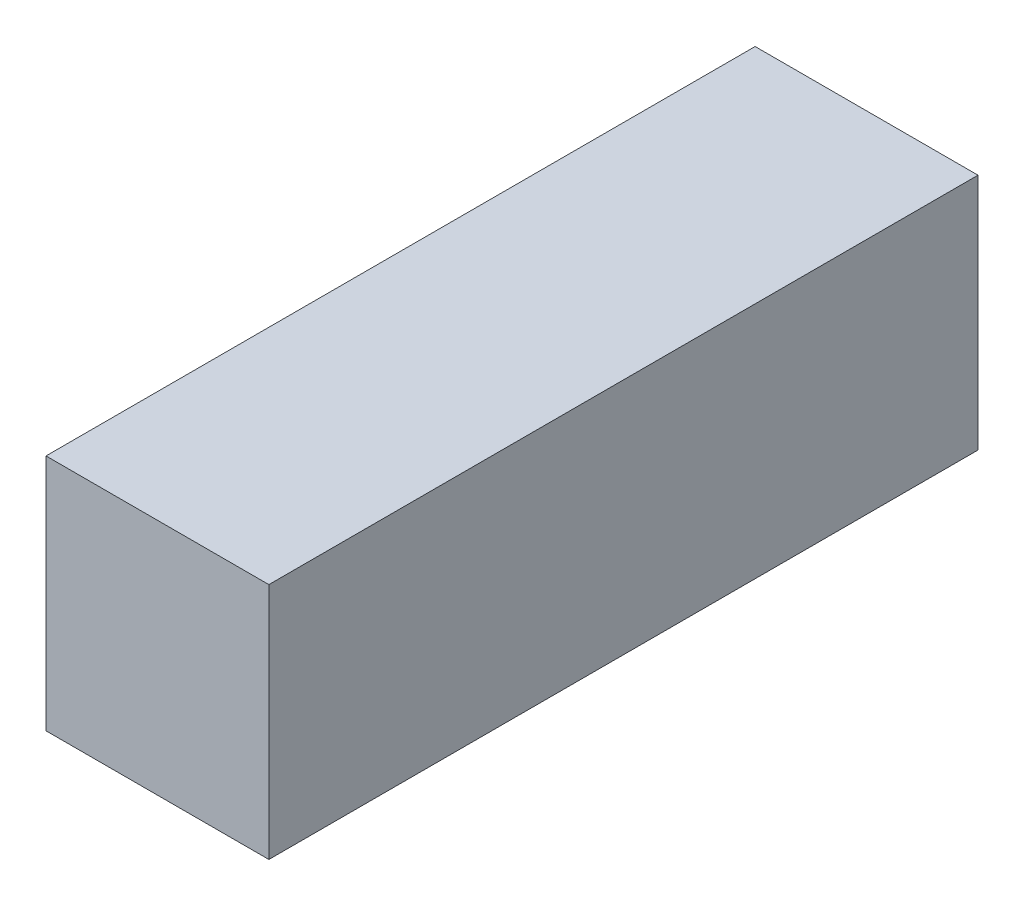
ISO-10303-21;
HEADER;
FILE_DESCRIPTION(('STEP AP214'),'2;1');
FILE_NAME('part.step','',(''),(''),'','','');
FILE_SCHEMA(('AUTOMOTIVE_DESIGN { 1 0 10303 214 1 1 1 1 }'));
ENDSEC;
DATA;
#1=APPLICATION_CONTEXT('core data for automotive mechanical design processes');
#2=APPLICATION_PROTOCOL_DEFINITION('international standard','automotive_design',2000,#1);
#3=PRODUCT_CONTEXT('',#1,'mechanical');
#4=PRODUCT('Part','Part','',(#3));
#5=PRODUCT_RELATED_PRODUCT_CATEGORY('part','',(#4));
#6=PRODUCT_DEFINITION_FORMATION('','',#4);
#7=PRODUCT_DEFINITION_CONTEXT('part definition',#1,'design');
#8=PRODUCT_DEFINITION('design','',#6,#7);
#9=PRODUCT_DEFINITION_SHAPE('','',#8);
#10=(LENGTH_UNIT() NAMED_UNIT(*) SI_UNIT(.MILLI.,.METRE.));
#11=(NAMED_UNIT(*) PLANE_ANGLE_UNIT() SI_UNIT($,.RADIAN.));
#12=(NAMED_UNIT(*) SI_UNIT($,.STERADIAN.) SOLID_ANGLE_UNIT());
#13=UNCERTAINTY_MEASURE_WITH_UNIT(LENGTH_MEASURE(1.E-05),#10,'distance_accuracy_value','');
#14=(GEOMETRIC_REPRESENTATION_CONTEXT(3) GLOBAL_UNCERTAINTY_ASSIGNED_CONTEXT((#13)) GLOBAL_UNIT_ASSIGNED_CONTEXT((#10,
#11,#12)) REPRESENTATION_CONTEXT('',''));
#15=CARTESIAN_POINT('',(0.,0.,0.));
#16=DIRECTION('',(0.,0.,1.));
#17=DIRECTION('',(1.,0.,0.));
#18=AXIS2_PLACEMENT_3D('',#15,#16,#17);
#19=CARTESIAN_POINT('',(0.,0.,140.));
#20=DIRECTION('',(1.,0.,0.));
#21=DIRECTION('',(0.,0.,-1.));
#22=AXIS2_PLACEMENT_3D('',#19,#20,#21);
#23=PLANE('',#22);
#24=DIRECTION('',(0.,-1.,0.));
#25=VECTOR('',#24,1.);
#26=CARTESIAN_POINT('',(0.,0.,0.));
#27=LINE('',#26,#25);
#28=CARTESIAN_POINT('',(0.,47.,0.));
#29=VERTEX_POINT('',#28);
#30=CARTESIAN_POINT('',(0.,0.,0.));
#31=VERTEX_POINT('',#30);
#32=EDGE_CURVE('E105',#29,#31,#27,.T.);
#33=ORIENTED_EDGE('',*,*,#32,.T.);
#34=DIRECTION('',(0.,0.,-1.));
#35=VECTOR('',#34,1.);
#36=CARTESIAN_POINT('',(0.,0.,140.));
#37=LINE('',#36,#35);
#38=CARTESIAN_POINT('',(0.,0.,140.));
#39=VERTEX_POINT('',#38);
#40=EDGE_CURVE('E11',#39,#31,#37,.T.);
#41=ORIENTED_EDGE('',*,*,#40,.F.);
#42=DIRECTION('',(0.,-1.,0.));
#43=VECTOR('',#42,1.);
#44=CARTESIAN_POINT('',(0.,0.,140.));
#45=LINE('',#44,#43);
#46=CARTESIAN_POINT('',(0.,47.,140.));
#47=VERTEX_POINT('',#46);
#48=EDGE_CURVE('E89',#47,#39,#45,.T.);
#49=ORIENTED_EDGE('',*,*,#48,.F.);
#50=DIRECTION('',(0.,0.,-1.));
#51=VECTOR('',#50,1.);
#52=CARTESIAN_POINT('',(0.,47.,140.));
#53=LINE('',#52,#51);
#54=EDGE_CURVE('E97',#47,#29,#53,.T.);
#55=ORIENTED_EDGE('',*,*,#54,.T.);
#56=EDGE_LOOP('',(#33,#41,#49,#55));
#57=FACE_BOUND('',#56,.T.);
#58=ADVANCED_FACE('F39',(#57),#23,.F.);
#59=CARTESIAN_POINT('',(0.,0.,140.));
#60=DIRECTION('',(0.,1.,0.));
#61=DIRECTION('',(0.,0.,1.));
#62=AXIS2_PLACEMENT_3D('',#59,#60,#61);
#63=PLANE('',#62);
#64=DIRECTION('',(1.,0.,0.));
#65=VECTOR('',#64,1.);
#66=CARTESIAN_POINT('',(0.,0.,0.));
#67=LINE('',#66,#65);
#68=CARTESIAN_POINT('',(44.,0.,0.));
#69=VERTEX_POINT('',#68);
#70=EDGE_CURVE('E92',#31,#69,#67,.T.);
#71=ORIENTED_EDGE('',*,*,#70,.T.);
#72=DIRECTION('',(0.,0.,-1.));
#73=VECTOR('',#72,1.);
#74=CARTESIAN_POINT('',(44.,0.,140.));
#75=LINE('',#74,#73);
#76=CARTESIAN_POINT('',(44.,0.,140.));
#77=VERTEX_POINT('',#76);
#78=EDGE_CURVE('E50',#77,#69,#75,.T.);
#79=ORIENTED_EDGE('',*,*,#78,.F.);
#80=DIRECTION('',(1.,0.,0.));
#81=VECTOR('',#80,1.);
#82=CARTESIAN_POINT('',(0.,0.,140.));
#83=LINE('',#82,#81);
#84=EDGE_CURVE('E82',#39,#77,#83,.T.);
#85=ORIENTED_EDGE('',*,*,#84,.F.);
#86=ORIENTED_EDGE('',*,*,#40,.T.);
#87=EDGE_LOOP('',(#71,#79,#85,#86));
#88=FACE_BOUND('',#87,.T.);
#89=ADVANCED_FACE('F93',(#88),#63,.F.);
#90=CARTESIAN_POINT('',(44.,0.,140.));
#91=DIRECTION('',(-1.,0.,0.));
#92=DIRECTION('',(0.,-1.,0.));
#93=AXIS2_PLACEMENT_3D('',#90,#91,#92);
#94=PLANE('',#93);
#95=DIRECTION('',(0.,1.,0.));
#96=VECTOR('',#95,1.);
#97=CARTESIAN_POINT('',(44.,0.,0.));
#98=LINE('',#97,#96);
#99=CARTESIAN_POINT('',(44.,47.,0.));
#100=VERTEX_POINT('',#99);
#101=EDGE_CURVE('E72',#69,#100,#98,.T.);
#102=ORIENTED_EDGE('',*,*,#101,.T.);
#103=DIRECTION('',(0.,0.,-1.));
#104=VECTOR('',#103,1.);
#105=CARTESIAN_POINT('',(44.,47.,140.));
#106=LINE('',#105,#104);
#107=CARTESIAN_POINT('',(44.,47.,140.));
#108=VERTEX_POINT('',#107);
#109=EDGE_CURVE('E94',#108,#100,#106,.T.);
#110=ORIENTED_EDGE('',*,*,#109,.F.);
#111=DIRECTION('',(0.,1.,0.));
#112=VECTOR('',#111,1.);
#113=CARTESIAN_POINT('',(44.,0.,140.));
#114=LINE('',#113,#112);
#115=EDGE_CURVE('E88',#77,#108,#114,.T.);
#116=ORIENTED_EDGE('',*,*,#115,.F.);
#117=ORIENTED_EDGE('',*,*,#78,.T.);
#118=EDGE_LOOP('',(#102,#110,#116,#117));
#119=FACE_BOUND('',#118,.T.);
#120=ADVANCED_FACE('F96',(#119),#94,.F.);
#121=CARTESIAN_POINT('',(0.,47.,140.));
#122=DIRECTION('',(0.,-1.,0.));
#123=DIRECTION('',(0.,0.,-1.));
#124=AXIS2_PLACEMENT_3D('',#121,#122,#123);
#125=PLANE('',#124);
#126=DIRECTION('',(-1.,0.,0.));
#127=VECTOR('',#126,1.);
#128=CARTESIAN_POINT('',(0.,47.,0.));
#129=LINE('',#128,#127);
#130=EDGE_CURVE('E76',#100,#29,#129,.T.);
#131=ORIENTED_EDGE('',*,*,#130,.T.);
#132=ORIENTED_EDGE('',*,*,#54,.F.);
#133=DIRECTION('',(-1.,0.,0.));
#134=VECTOR('',#133,1.);
#135=CARTESIAN_POINT('',(0.,47.,140.));
#136=LINE('',#135,#134);
#137=EDGE_CURVE('E54',#108,#47,#136,.T.);
#138=ORIENTED_EDGE('',*,*,#137,.F.);
#139=ORIENTED_EDGE('',*,*,#109,.T.);
#140=EDGE_LOOP('',(#131,#132,#138,#139));
#141=FACE_BOUND('',#140,.T.);
#142=ADVANCED_FACE('F108',(#141),#125,.F.);
#143=CARTESIAN_POINT('',(0.,0.,140.));
#144=DIRECTION('',(0.,0.,-1.));
#145=DIRECTION('',(-1.,0.,0.));
#146=AXIS2_PLACEMENT_3D('',#143,#144,#145);
#147=PLANE('',#146);
#148=ORIENTED_EDGE('',*,*,#48,.T.);
#149=ORIENTED_EDGE('',*,*,#84,.T.);
#150=ORIENTED_EDGE('',*,*,#115,.T.);
#151=ORIENTED_EDGE('',*,*,#137,.T.);
#152=EDGE_LOOP('',(#148,#149,#150,#151));
#153=FACE_BOUND('',#152,.T.);
#154=ADVANCED_FACE('F86',(#153),#147,.F.);
#155=CARTESIAN_POINT('',(0.,0.,0.));
#156=DIRECTION('',(0.,0.,-1.));
#157=DIRECTION('',(-1.,0.,0.));
#158=AXIS2_PLACEMENT_3D('',#155,#156,#157);
#159=PLANE('',#158);
#160=ORIENTED_EDGE('',*,*,#32,.F.);
#161=ORIENTED_EDGE('',*,*,#130,.F.);
#162=ORIENTED_EDGE('',*,*,#101,.F.);
#163=ORIENTED_EDGE('',*,*,#70,.F.);
#164=EDGE_LOOP('',(#160,#161,#162,#163));
#165=FACE_BOUND('',#164,.T.);
#166=ADVANCED_FACE('F115',(#165),#159,.T.);
#167=CLOSED_SHELL('',(#58,#89,#120,#142,#154,#166));
#168=MANIFOLD_SOLID_BREP('B2',#167);
#169=ADVANCED_BREP_SHAPE_REPRESENTATION('',(#18,#168),#14);
#170=SHAPE_DEFINITION_REPRESENTATION(#9,#169);
ENDSEC;
END-ISO-10303-21;
